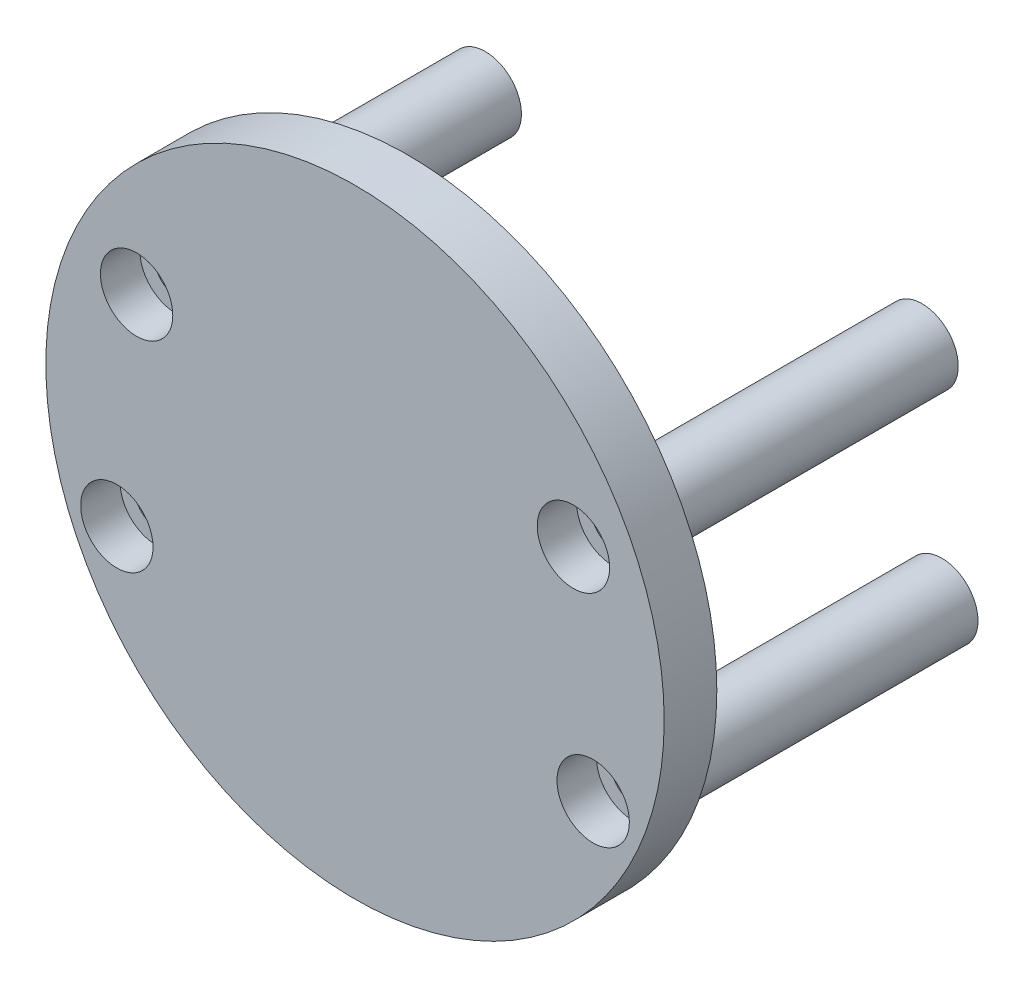
ISO-10303-21;
HEADER;
FILE_DESCRIPTION(('STEP AP214'),'2;1');
FILE_NAME('part.step','',(''),(''),'','','');
FILE_SCHEMA(('AUTOMOTIVE_DESIGN { 1 0 10303 214 1 1 1 1 }'));
ENDSEC;
DATA;
#1=APPLICATION_CONTEXT('core data for automotive mechanical design processes');
#2=APPLICATION_PROTOCOL_DEFINITION('international standard','automotive_design',2000,#1);
#3=PRODUCT_CONTEXT('',#1,'mechanical');
#4=PRODUCT('Part','Part','',(#3));
#5=PRODUCT_RELATED_PRODUCT_CATEGORY('part','',(#4));
#6=PRODUCT_DEFINITION_FORMATION('','',#4);
#7=PRODUCT_DEFINITION_CONTEXT('part definition',#1,'design');
#8=PRODUCT_DEFINITION('design','',#6,#7);
#9=PRODUCT_DEFINITION_SHAPE('','',#8);
#10=(LENGTH_UNIT() NAMED_UNIT(*) SI_UNIT(.MILLI.,.METRE.));
#11=(NAMED_UNIT(*) PLANE_ANGLE_UNIT() SI_UNIT($,.RADIAN.));
#12=(NAMED_UNIT(*) SI_UNIT($,.STERADIAN.) SOLID_ANGLE_UNIT());
#13=UNCERTAINTY_MEASURE_WITH_UNIT(LENGTH_MEASURE(1.E-05),#10,'distance_accuracy_value','');
#14=(GEOMETRIC_REPRESENTATION_CONTEXT(3) GLOBAL_UNCERTAINTY_ASSIGNED_CONTEXT((#13)) GLOBAL_UNIT_ASSIGNED_CONTEXT((#10,
#11,#12)) REPRESENTATION_CONTEXT('',''));
#15=CARTESIAN_POINT('',(0.,0.,0.));
#16=DIRECTION('',(0.,0.,1.));
#17=DIRECTION('',(1.,0.,0.));
#18=AXIS2_PLACEMENT_3D('',#15,#16,#17);
#19=CARTESIAN_POINT('',(-16.6,8.,-23.5));
#20=DIRECTION('',(0.,0.,1.));
#21=DIRECTION('',(1.,0.,0.));
#22=AXIS2_PLACEMENT_3D('',#19,#20,#21);
#23=CYLINDRICAL_SURFACE('',#22,1.6);
#24=CARTESIAN_POINT('',(-16.6,8.,-23.5));
#25=DIRECTION('',(0.,0.,1.));
#26=DIRECTION('',(1.,0.,0.));
#27=AXIS2_PLACEMENT_3D('',#24,#25,#26);
#28=CIRCLE('',#27,1.6);
#29=CARTESIAN_POINT('',(-15.,8.,-23.5));
#30=VERTEX_POINT('',#29);
#31=EDGE_CURVE('E55',#30,#30,#28,.T.);
#32=ORIENTED_EDGE('',*,*,#31,.F.);
#33=EDGE_LOOP('',(#32));
#34=FACE_BOUND('',#33,.T.);
#35=CARTESIAN_POINT('',(-16.6,8.,0.));
#36=DIRECTION('',(0.,0.,1.));
#37=DIRECTION('',(1.,0.,0.));
#38=AXIS2_PLACEMENT_3D('',#35,#36,#37);
#39=CIRCLE('',#38,1.6);
#40=CARTESIAN_POINT('',(-15.,8.,0.));
#41=VERTEX_POINT('',#40);
#42=EDGE_CURVE('E61',#41,#41,#39,.T.);
#43=ORIENTED_EDGE('',*,*,#42,.T.);
#44=EDGE_LOOP('',(#43));
#45=FACE_BOUND('',#44,.T.);
#46=ADVANCED_FACE('F48',(#34,#45),#23,.F.);
#47=CARTESIAN_POINT('',(-16.6,8.,-23.5));
#48=DIRECTION('',(0.,0.,1.));
#49=DIRECTION('',(1.,0.,0.));
#50=AXIS2_PLACEMENT_3D('',#47,#48,#49);
#51=CYLINDRICAL_SURFACE('',#50,2.75);
#52=CARTESIAN_POINT('',(-16.6,8.,-23.5));
#53=DIRECTION('',(0.,0.,1.));
#54=DIRECTION('',(1.,0.,0.));
#55=AXIS2_PLACEMENT_3D('',#52,#53,#54);
#56=CIRCLE('',#55,2.75);
#57=CARTESIAN_POINT('',(-13.85,8.,-23.5));
#58=VERTEX_POINT('',#57);
#59=EDGE_CURVE('E11',#58,#58,#56,.T.);
#60=ORIENTED_EDGE('',*,*,#59,.T.);
#61=EDGE_LOOP('',(#60));
#62=FACE_BOUND('',#61,.T.);
#63=CARTESIAN_POINT('',(-16.6,8.,0.));
#64=DIRECTION('',(0.,0.,1.));
#65=DIRECTION('',(1.,0.,0.));
#66=AXIS2_PLACEMENT_3D('',#63,#64,#65);
#67=CIRCLE('',#66,2.75);
#68=CARTESIAN_POINT('',(-13.85,8.,0.));
#69=VERTEX_POINT('',#68);
#70=EDGE_CURVE('E51',#69,#69,#67,.T.);
#71=ORIENTED_EDGE('',*,*,#70,.F.);
#72=EDGE_LOOP('',(#71));
#73=FACE_BOUND('',#72,.T.);
#74=ADVANCED_FACE('F70',(#62,#73),#51,.T.);
#75=CARTESIAN_POINT('',(0.,0.,-23.5));
#76=DIRECTION('',(0.,0.,1.));
#77=DIRECTION('',(1.,0.,0.));
#78=AXIS2_PLACEMENT_3D('',#75,#76,#77);
#79=PLANE('',#78);
#80=ORIENTED_EDGE('',*,*,#31,.T.);
#81=EDGE_LOOP('',(#80));
#82=FACE_BOUND('',#81,.T.);
#83=ORIENTED_EDGE('',*,*,#59,.F.);
#84=EDGE_LOOP('',(#83));
#85=FACE_BOUND('',#84,.T.);
#86=ADVANCED_FACE('F72',(#82,#85),#79,.F.);
#87=CARTESIAN_POINT('',(0.,0.,0.));
#88=DIRECTION('',(0.,0.,1.));
#89=DIRECTION('',(1.,0.,0.));
#90=AXIS2_PLACEMENT_3D('',#87,#88,#89);
#91=PLANE('',#90);
#92=ORIENTED_EDGE('',*,*,#42,.F.);
#93=EDGE_LOOP('',(#92));
#94=FACE_BOUND('',#93,.T.);
#95=ORIENTED_EDGE('',*,*,#70,.T.);
#96=EDGE_LOOP('',(#95));
#97=FACE_BOUND('',#96,.T.);
#98=ADVANCED_FACE('F68',(#94,#97),#91,.T.);
#99=CLOSED_SHELL('',(#46,#74,#86,#98));
#100=MANIFOLD_SOLID_BREP('B2',#99);
#101=CARTESIAN_POINT('',(16.6,8.,-23.5));
#102=DIRECTION('',(0.,0.,1.));
#103=DIRECTION('',(1.,0.,0.));
#104=AXIS2_PLACEMENT_3D('',#101,#102,#103);
#105=CYLINDRICAL_SURFACE('',#104,1.6);
#106=CARTESIAN_POINT('',(16.6,8.,-23.5));
#107=DIRECTION('',(0.,0.,1.));
#108=DIRECTION('',(1.,0.,0.));
#109=AXIS2_PLACEMENT_3D('',#106,#107,#108);
#110=CIRCLE('',#109,1.6);
#111=CARTESIAN_POINT('',(18.2,8.,-23.5));
#112=VERTEX_POINT('',#111);
#113=EDGE_CURVE('E125',#112,#112,#110,.T.);
#114=ORIENTED_EDGE('',*,*,#113,.F.);
#115=EDGE_LOOP('',(#114));
#116=FACE_BOUND('',#115,.T.);
#117=CARTESIAN_POINT('',(16.6,8.,0.));
#118=DIRECTION('',(0.,0.,1.));
#119=DIRECTION('',(1.,0.,0.));
#120=AXIS2_PLACEMENT_3D('',#117,#118,#119);
#121=CIRCLE('',#120,1.6);
#122=CARTESIAN_POINT('',(18.2,8.,0.));
#123=VERTEX_POINT('',#122);
#124=EDGE_CURVE('E131',#123,#123,#121,.T.);
#125=ORIENTED_EDGE('',*,*,#124,.T.);
#126=EDGE_LOOP('',(#125));
#127=FACE_BOUND('',#126,.T.);
#128=ADVANCED_FACE('F118',(#116,#127),#105,.F.);
#129=CARTESIAN_POINT('',(16.6,8.,-23.5));
#130=DIRECTION('',(0.,0.,1.));
#131=DIRECTION('',(1.,0.,0.));
#132=AXIS2_PLACEMENT_3D('',#129,#130,#131);
#133=CYLINDRICAL_SURFACE('',#132,2.75);
#134=CARTESIAN_POINT('',(16.6,8.,-23.5));
#135=DIRECTION('',(0.,0.,1.));
#136=DIRECTION('',(1.,0.,0.));
#137=AXIS2_PLACEMENT_3D('',#134,#135,#136);
#138=CIRCLE('',#137,2.75);
#139=CARTESIAN_POINT('',(19.35,8.,-23.5));
#140=VERTEX_POINT('',#139);
#141=EDGE_CURVE('E47',#140,#140,#138,.T.);
#142=ORIENTED_EDGE('',*,*,#141,.T.);
#143=EDGE_LOOP('',(#142));
#144=FACE_BOUND('',#143,.T.);
#145=CARTESIAN_POINT('',(16.6,8.,0.));
#146=DIRECTION('',(0.,0.,1.));
#147=DIRECTION('',(1.,0.,0.));
#148=AXIS2_PLACEMENT_3D('',#145,#146,#147);
#149=CIRCLE('',#148,2.75);
#150=CARTESIAN_POINT('',(19.35,8.,0.));
#151=VERTEX_POINT('',#150);
#152=EDGE_CURVE('E121',#151,#151,#149,.T.);
#153=ORIENTED_EDGE('',*,*,#152,.F.);
#154=EDGE_LOOP('',(#153));
#155=FACE_BOUND('',#154,.T.);
#156=ADVANCED_FACE('F140',(#144,#155),#133,.T.);
#157=CARTESIAN_POINT('',(0.,0.,-23.5));
#158=DIRECTION('',(0.,0.,1.));
#159=DIRECTION('',(1.,0.,0.));
#160=AXIS2_PLACEMENT_3D('',#157,#158,#159);
#161=PLANE('',#160);
#162=ORIENTED_EDGE('',*,*,#113,.T.);
#163=EDGE_LOOP('',(#162));
#164=FACE_BOUND('',#163,.T.);
#165=ORIENTED_EDGE('',*,*,#141,.F.);
#166=EDGE_LOOP('',(#165));
#167=FACE_BOUND('',#166,.T.);
#168=ADVANCED_FACE('F142',(#164,#167),#161,.F.);
#169=CARTESIAN_POINT('',(0.,0.,0.));
#170=DIRECTION('',(0.,0.,1.));
#171=DIRECTION('',(1.,0.,0.));
#172=AXIS2_PLACEMENT_3D('',#169,#170,#171);
#173=PLANE('',#172);
#174=ORIENTED_EDGE('',*,*,#124,.F.);
#175=EDGE_LOOP('',(#174));
#176=FACE_BOUND('',#175,.T.);
#177=ORIENTED_EDGE('',*,*,#152,.T.);
#178=EDGE_LOOP('',(#177));
#179=FACE_BOUND('',#178,.T.);
#180=ADVANCED_FACE('F138',(#176,#179),#173,.T.);
#181=CLOSED_SHELL('',(#128,#156,#168,#180));
#182=MANIFOLD_SOLID_BREP('B6',#181);
#183=CARTESIAN_POINT('',(18.1,-8.,-23.5));
#184=DIRECTION('',(0.,0.,1.));
#185=DIRECTION('',(1.,0.,0.));
#186=AXIS2_PLACEMENT_3D('',#183,#184,#185);
#187=CYLINDRICAL_SURFACE('',#186,1.6);
#188=CARTESIAN_POINT('',(18.1,-8.,-23.5));
#189=DIRECTION('',(0.,0.,1.));
#190=DIRECTION('',(1.,0.,0.));
#191=AXIS2_PLACEMENT_3D('',#188,#189,#190);
#192=CIRCLE('',#191,1.6);
#193=CARTESIAN_POINT('',(19.7,-8.,-23.5));
#194=VERTEX_POINT('',#193);
#195=EDGE_CURVE('E195',#194,#194,#192,.T.);
#196=ORIENTED_EDGE('',*,*,#195,.F.);
#197=EDGE_LOOP('',(#196));
#198=FACE_BOUND('',#197,.T.);
#199=CARTESIAN_POINT('',(18.1,-8.,0.));
#200=DIRECTION('',(0.,0.,1.));
#201=DIRECTION('',(1.,0.,0.));
#202=AXIS2_PLACEMENT_3D('',#199,#200,#201);
#203=CIRCLE('',#202,1.6);
#204=CARTESIAN_POINT('',(19.7,-8.,0.));
#205=VERTEX_POINT('',#204);
#206=EDGE_CURVE('E201',#205,#205,#203,.T.);
#207=ORIENTED_EDGE('',*,*,#206,.T.);
#208=EDGE_LOOP('',(#207));
#209=FACE_BOUND('',#208,.T.);
#210=ADVANCED_FACE('F188',(#198,#209),#187,.F.);
#211=CARTESIAN_POINT('',(18.1,-8.,-23.5));
#212=DIRECTION('',(0.,0.,1.));
#213=DIRECTION('',(1.,0.,0.));
#214=AXIS2_PLACEMENT_3D('',#211,#212,#213);
#215=CYLINDRICAL_SURFACE('',#214,2.75);
#216=CARTESIAN_POINT('',(18.1,-8.,-23.5));
#217=DIRECTION('',(0.,0.,1.));
#218=DIRECTION('',(1.,0.,0.));
#219=AXIS2_PLACEMENT_3D('',#216,#217,#218);
#220=CIRCLE('',#219,2.75);
#221=CARTESIAN_POINT('',(20.85,-8.,-23.5));
#222=VERTEX_POINT('',#221);
#223=EDGE_CURVE('E117',#222,#222,#220,.T.);
#224=ORIENTED_EDGE('',*,*,#223,.T.);
#225=EDGE_LOOP('',(#224));
#226=FACE_BOUND('',#225,.T.);
#227=CARTESIAN_POINT('',(18.1,-8.,0.));
#228=DIRECTION('',(0.,0.,1.));
#229=DIRECTION('',(1.,0.,0.));
#230=AXIS2_PLACEMENT_3D('',#227,#228,#229);
#231=CIRCLE('',#230,2.75);
#232=CARTESIAN_POINT('',(20.85,-8.,0.));
#233=VERTEX_POINT('',#232);
#234=EDGE_CURVE('E191',#233,#233,#231,.T.);
#235=ORIENTED_EDGE('',*,*,#234,.F.);
#236=EDGE_LOOP('',(#235));
#237=FACE_BOUND('',#236,.T.);
#238=ADVANCED_FACE('F210',(#226,#237),#215,.T.);
#239=CARTESIAN_POINT('',(0.,0.,-23.5));
#240=DIRECTION('',(0.,0.,1.));
#241=DIRECTION('',(1.,0.,0.));
#242=AXIS2_PLACEMENT_3D('',#239,#240,#241);
#243=PLANE('',#242);
#244=ORIENTED_EDGE('',*,*,#195,.T.);
#245=EDGE_LOOP('',(#244));
#246=FACE_BOUND('',#245,.T.);
#247=ORIENTED_EDGE('',*,*,#223,.F.);
#248=EDGE_LOOP('',(#247));
#249=FACE_BOUND('',#248,.T.);
#250=ADVANCED_FACE('F212',(#246,#249),#243,.F.);
#251=CARTESIAN_POINT('',(0.,0.,0.));
#252=DIRECTION('',(0.,0.,1.));
#253=DIRECTION('',(1.,0.,0.));
#254=AXIS2_PLACEMENT_3D('',#251,#252,#253);
#255=PLANE('',#254);
#256=ORIENTED_EDGE('',*,*,#206,.F.);
#257=EDGE_LOOP('',(#256));
#258=FACE_BOUND('',#257,.T.);
#259=ORIENTED_EDGE('',*,*,#234,.T.);
#260=EDGE_LOOP('',(#259));
#261=FACE_BOUND('',#260,.T.);
#262=ADVANCED_FACE('F208',(#258,#261),#255,.T.);
#263=CLOSED_SHELL('',(#210,#238,#250,#262));
#264=MANIFOLD_SOLID_BREP('B42',#263);
#265=CARTESIAN_POINT('',(-18.1,-8.,-23.5));
#266=DIRECTION('',(0.,0.,1.));
#267=DIRECTION('',(1.,0.,0.));
#268=AXIS2_PLACEMENT_3D('',#265,#266,#267);
#269=CYLINDRICAL_SURFACE('',#268,1.6);
#270=CARTESIAN_POINT('',(-18.1,-8.,-23.5));
#271=DIRECTION('',(0.,0.,1.));
#272=DIRECTION('',(1.,0.,0.));
#273=AXIS2_PLACEMENT_3D('',#270,#271,#272);
#274=CIRCLE('',#273,1.6);
#275=CARTESIAN_POINT('',(-16.5,-8.,-23.5));
#276=VERTEX_POINT('',#275);
#277=EDGE_CURVE('E264',#276,#276,#274,.T.);
#278=ORIENTED_EDGE('',*,*,#277,.F.);
#279=EDGE_LOOP('',(#278));
#280=FACE_BOUND('',#279,.T.);
#281=CARTESIAN_POINT('',(-18.1,-8.,0.));
#282=DIRECTION('',(0.,0.,1.));
#283=DIRECTION('',(1.,0.,0.));
#284=AXIS2_PLACEMENT_3D('',#281,#282,#283);
#285=CIRCLE('',#284,1.6);
#286=CARTESIAN_POINT('',(-16.5,-8.,0.));
#287=VERTEX_POINT('',#286);
#288=EDGE_CURVE('E270',#287,#287,#285,.T.);
#289=ORIENTED_EDGE('',*,*,#288,.T.);
#290=EDGE_LOOP('',(#289));
#291=FACE_BOUND('',#290,.T.);
#292=ADVANCED_FACE('F257',(#280,#291),#269,.F.);
#293=CARTESIAN_POINT('',(-18.1,-8.,-23.5));
#294=DIRECTION('',(0.,0.,1.));
#295=DIRECTION('',(1.,0.,0.));
#296=AXIS2_PLACEMENT_3D('',#293,#294,#295);
#297=CYLINDRICAL_SURFACE('',#296,2.75);
#298=CARTESIAN_POINT('',(-18.1,-8.,-23.5));
#299=DIRECTION('',(0.,0.,1.));
#300=DIRECTION('',(1.,0.,0.));
#301=AXIS2_PLACEMENT_3D('',#298,#299,#300);
#302=CIRCLE('',#301,2.75);
#303=CARTESIAN_POINT('',(-15.35,-8.,-23.5));
#304=VERTEX_POINT('',#303);
#305=EDGE_CURVE('E187',#304,#304,#302,.T.);
#306=ORIENTED_EDGE('',*,*,#305,.T.);
#307=EDGE_LOOP('',(#306));
#308=FACE_BOUND('',#307,.T.);
#309=CARTESIAN_POINT('',(-18.1,-8.,0.));
#310=DIRECTION('',(0.,0.,1.));
#311=DIRECTION('',(1.,0.,0.));
#312=AXIS2_PLACEMENT_3D('',#309,#310,#311);
#313=CIRCLE('',#312,2.75);
#314=CARTESIAN_POINT('',(-15.35,-8.,0.));
#315=VERTEX_POINT('',#314);
#316=EDGE_CURVE('E260',#315,#315,#313,.T.);
#317=ORIENTED_EDGE('',*,*,#316,.F.);
#318=EDGE_LOOP('',(#317));
#319=FACE_BOUND('',#318,.T.);
#320=ADVANCED_FACE('F279',(#308,#319),#297,.T.);
#321=CARTESIAN_POINT('',(0.,0.,-23.5));
#322=DIRECTION('',(0.,0.,1.));
#323=DIRECTION('',(1.,0.,0.));
#324=AXIS2_PLACEMENT_3D('',#321,#322,#323);
#325=PLANE('',#324);
#326=ORIENTED_EDGE('',*,*,#277,.T.);
#327=EDGE_LOOP('',(#326));
#328=FACE_BOUND('',#327,.T.);
#329=ORIENTED_EDGE('',*,*,#305,.F.);
#330=EDGE_LOOP('',(#329));
#331=FACE_BOUND('',#330,.T.);
#332=ADVANCED_FACE('F281',(#328,#331),#325,.F.);
#333=CARTESIAN_POINT('',(0.,0.,0.));
#334=DIRECTION('',(0.,0.,1.));
#335=DIRECTION('',(1.,0.,0.));
#336=AXIS2_PLACEMENT_3D('',#333,#334,#335);
#337=PLANE('',#336);
#338=ORIENTED_EDGE('',*,*,#288,.F.);
#339=EDGE_LOOP('',(#338));
#340=FACE_BOUND('',#339,.T.);
#341=ORIENTED_EDGE('',*,*,#316,.T.);
#342=EDGE_LOOP('',(#341));
#343=FACE_BOUND('',#342,.T.);
#344=ADVANCED_FACE('F277',(#340,#343),#337,.T.);
#345=CLOSED_SHELL('',(#292,#320,#332,#344));
#346=MANIFOLD_SOLID_BREP('B112',#345);
#347=CARTESIAN_POINT('',(16.6,8.,-1.));
#348=DIRECTION('',(0.,0.,1.));
#349=DIRECTION('',(1.,0.,0.));
#350=AXIS2_PLACEMENT_3D('',#347,#348,#349);
#351=CYLINDRICAL_SURFACE('',#350,2.75);
#352=CARTESIAN_POINT('',(16.6,8.,-1.));
#353=DIRECTION('',(0.,0.,1.));
#354=DIRECTION('',(1.,0.,0.));
#355=AXIS2_PLACEMENT_3D('',#352,#353,#354);
#356=CIRCLE('',#355,2.75);
#357=CARTESIAN_POINT('',(19.35,8.,-1.));
#358=VERTEX_POINT('',#357);
#359=EDGE_CURVE('E326',#358,#358,#356,.T.);
#360=ORIENTED_EDGE('',*,*,#359,.F.);
#361=EDGE_LOOP('',(#360));
#362=FACE_BOUND('',#361,.T.);
#363=CARTESIAN_POINT('',(16.6,8.,3.));
#364=DIRECTION('',(0.,0.,1.));
#365=DIRECTION('',(1.,0.,0.));
#366=AXIS2_PLACEMENT_3D('',#363,#364,#365);
#367=CIRCLE('',#366,2.75);
#368=CARTESIAN_POINT('',(19.35,8.,3.));
#369=VERTEX_POINT('',#368);
#370=EDGE_CURVE('E345',#369,#369,#367,.T.);
#371=ORIENTED_EDGE('',*,*,#370,.T.);
#372=EDGE_LOOP('',(#371));
#373=FACE_BOUND('',#372,.T.);
#374=ADVANCED_FACE('F319',(#362,#373),#351,.F.);
#375=CARTESIAN_POINT('',(-16.6,8.,-1.));
#376=DIRECTION('',(0.,0.,1.));
#377=DIRECTION('',(1.,0.,0.));
#378=AXIS2_PLACEMENT_3D('',#375,#376,#377);
#379=CYLINDRICAL_SURFACE('',#378,2.75);
#380=CARTESIAN_POINT('',(-16.6,8.,-1.));
#381=DIRECTION('',(0.,0.,1.));
#382=DIRECTION('',(1.,0.,0.));
#383=AXIS2_PLACEMENT_3D('',#380,#381,#382);
#384=CIRCLE('',#383,2.75);
#385=CARTESIAN_POINT('',(-13.85,8.,-1.));
#386=VERTEX_POINT('',#385);
#387=EDGE_CURVE('E330',#386,#386,#384,.T.);
#388=ORIENTED_EDGE('',*,*,#387,.F.);
#389=EDGE_LOOP('',(#388));
#390=FACE_BOUND('',#389,.T.);
#391=CARTESIAN_POINT('',(-16.6,8.,3.));
#392=DIRECTION('',(0.,0.,1.));
#393=DIRECTION('',(1.,0.,0.));
#394=AXIS2_PLACEMENT_3D('',#391,#392,#393);
#395=CIRCLE('',#394,2.75);
#396=CARTESIAN_POINT('',(-13.85,8.,3.));
#397=VERTEX_POINT('',#396);
#398=EDGE_CURVE('E348',#397,#397,#395,.T.);
#399=ORIENTED_EDGE('',*,*,#398,.T.);
#400=EDGE_LOOP('',(#399));
#401=FACE_BOUND('',#400,.T.);
#402=ADVANCED_FACE('F385',(#390,#401),#379,.F.);
#403=CARTESIAN_POINT('',(-18.1,-8.,-1.));
#404=DIRECTION('',(0.,0.,1.));
#405=DIRECTION('',(1.,0.,0.));
#406=AXIS2_PLACEMENT_3D('',#403,#404,#405);
#407=CYLINDRICAL_SURFACE('',#406,2.75);
#408=CARTESIAN_POINT('',(-18.1,-8.,-1.));
#409=DIRECTION('',(0.,0.,1.));
#410=DIRECTION('',(1.,0.,0.));
#411=AXIS2_PLACEMENT_3D('',#408,#409,#410);
#412=CIRCLE('',#411,2.75);
#413=CARTESIAN_POINT('',(-15.35,-8.,-1.));
#414=VERTEX_POINT('',#413);
#415=EDGE_CURVE('E334',#414,#414,#412,.T.);
#416=ORIENTED_EDGE('',*,*,#415,.F.);
#417=EDGE_LOOP('',(#416));
#418=FACE_BOUND('',#417,.T.);
#419=CARTESIAN_POINT('',(-18.1,-8.,3.));
#420=DIRECTION('',(0.,0.,1.));
#421=DIRECTION('',(1.,0.,0.));
#422=AXIS2_PLACEMENT_3D('',#419,#420,#421);
#423=CIRCLE('',#422,2.75);
#424=CARTESIAN_POINT('',(-15.35,-8.,3.));
#425=VERTEX_POINT('',#424);
#426=EDGE_CURVE('E351',#425,#425,#423,.T.);
#427=ORIENTED_EDGE('',*,*,#426,.T.);
#428=EDGE_LOOP('',(#427));
#429=FACE_BOUND('',#428,.T.);
#430=ADVANCED_FACE('F381',(#418,#429),#407,.F.);
#431=CARTESIAN_POINT('',(18.1,-8.,-1.));
#432=DIRECTION('',(0.,0.,1.));
#433=DIRECTION('',(1.,0.,0.));
#434=AXIS2_PLACEMENT_3D('',#431,#432,#433);
#435=CYLINDRICAL_SURFACE('',#434,2.75);
#436=CARTESIAN_POINT('',(18.1,-8.,-1.));
#437=DIRECTION('',(0.,0.,1.));
#438=DIRECTION('',(1.,0.,0.));
#439=AXIS2_PLACEMENT_3D('',#436,#437,#438);
#440=CIRCLE('',#439,2.75);
#441=CARTESIAN_POINT('',(20.85,-8.,-1.));
#442=VERTEX_POINT('',#441);
#443=EDGE_CURVE('E339',#442,#442,#440,.T.);
#444=ORIENTED_EDGE('',*,*,#443,.F.);
#445=EDGE_LOOP('',(#444));
#446=FACE_BOUND('',#445,.T.);
#447=CARTESIAN_POINT('',(18.1,-8.,3.));
#448=DIRECTION('',(0.,0.,1.));
#449=DIRECTION('',(1.,0.,0.));
#450=AXIS2_PLACEMENT_3D('',#447,#448,#449);
#451=CIRCLE('',#450,2.75);
#452=CARTESIAN_POINT('',(20.85,-8.,3.));
#453=VERTEX_POINT('',#452);
#454=EDGE_CURVE('E354',#453,#453,#451,.T.);
#455=ORIENTED_EDGE('',*,*,#454,.T.);
#456=EDGE_LOOP('',(#455));
#457=FACE_BOUND('',#456,.T.);
#458=ADVANCED_FACE('F321',(#446,#457),#435,.F.);
#459=CARTESIAN_POINT('',(0.,0.,-1.));
#460=DIRECTION('',(0.,0.,1.));
#461=DIRECTION('',(1.,0.,0.));
#462=AXIS2_PLACEMENT_3D('',#459,#460,#461);
#463=CYLINDRICAL_SURFACE('',#462,23.5);
#464=CARTESIAN_POINT('',(0.,0.,-1.));
#465=DIRECTION('',(0.,0.,1.));
#466=DIRECTION('',(1.,0.,0.));
#467=AXIS2_PLACEMENT_3D('',#464,#465,#466);
#468=CIRCLE('',#467,23.5);
#469=CARTESIAN_POINT('',(23.5,0.,-1.));
#470=VERTEX_POINT('',#469);
#471=EDGE_CURVE('E256',#470,#470,#468,.T.);
#472=ORIENTED_EDGE('',*,*,#471,.T.);
#473=EDGE_LOOP('',(#472));
#474=FACE_BOUND('',#473,.T.);
#475=CARTESIAN_POINT('',(0.,0.,3.));
#476=DIRECTION('',(0.,0.,1.));
#477=DIRECTION('',(1.,0.,0.));
#478=AXIS2_PLACEMENT_3D('',#475,#476,#477);
#479=CIRCLE('',#478,23.5);
#480=CARTESIAN_POINT('',(23.5,0.,3.));
#481=VERTEX_POINT('',#480);
#482=EDGE_CURVE('E342',#481,#481,#479,.T.);
#483=ORIENTED_EDGE('',*,*,#482,.F.);
#484=EDGE_LOOP('',(#483));
#485=FACE_BOUND('',#484,.T.);
#486=ADVANCED_FACE('F372',(#474,#485),#463,.T.);
#487=CARTESIAN_POINT('',(0.,0.,-1.));
#488=DIRECTION('',(0.,0.,1.));
#489=DIRECTION('',(1.,0.,0.));
#490=AXIS2_PLACEMENT_3D('',#487,#488,#489);
#491=PLANE('',#490);
#492=ORIENTED_EDGE('',*,*,#443,.T.);
#493=EDGE_LOOP('',(#492));
#494=FACE_BOUND('',#493,.T.);
#495=ORIENTED_EDGE('',*,*,#415,.T.);
#496=EDGE_LOOP('',(#495));
#497=FACE_BOUND('',#496,.T.);
#498=ORIENTED_EDGE('',*,*,#387,.T.);
#499=EDGE_LOOP('',(#498));
#500=FACE_BOUND('',#499,.T.);
#501=ORIENTED_EDGE('',*,*,#359,.T.);
#502=EDGE_LOOP('',(#501));
#503=FACE_BOUND('',#502,.T.);
#504=ORIENTED_EDGE('',*,*,#471,.F.);
#505=EDGE_LOOP('',(#504));
#506=FACE_BOUND('',#505,.T.);
#507=ADVANCED_FACE('F362',(#494,#497,#500,#503,#506),#491,.F.);
#508=CARTESIAN_POINT('',(0.,0.,3.));
#509=DIRECTION('',(0.,0.,1.));
#510=DIRECTION('',(1.,0.,0.));
#511=AXIS2_PLACEMENT_3D('',#508,#509,#510);
#512=PLANE('',#511);
#513=ORIENTED_EDGE('',*,*,#454,.F.);
#514=EDGE_LOOP('',(#513));
#515=FACE_BOUND('',#514,.T.);
#516=ORIENTED_EDGE('',*,*,#426,.F.);
#517=EDGE_LOOP('',(#516));
#518=FACE_BOUND('',#517,.T.);
#519=ORIENTED_EDGE('',*,*,#398,.F.);
#520=EDGE_LOOP('',(#519));
#521=FACE_BOUND('',#520,.T.);
#522=ORIENTED_EDGE('',*,*,#370,.F.);
#523=EDGE_LOOP('',(#522));
#524=FACE_BOUND('',#523,.T.);
#525=ORIENTED_EDGE('',*,*,#482,.T.);
#526=EDGE_LOOP('',(#525));
#527=FACE_BOUND('',#526,.T.);
#528=ADVANCED_FACE('F359',(#515,#518,#521,#524,#527),#512,.T.);
#529=CLOSED_SHELL('',(#374,#402,#430,#458,#486,#507,#528));
#530=MANIFOLD_SOLID_BREP('B182',#529);
#531=ADVANCED_BREP_SHAPE_REPRESENTATION('',(#18,#100,#182,#264,#346,#530),#14);
#532=SHAPE_DEFINITION_REPRESENTATION(#9,#531);
ENDSEC;
END-ISO-10303-21;
